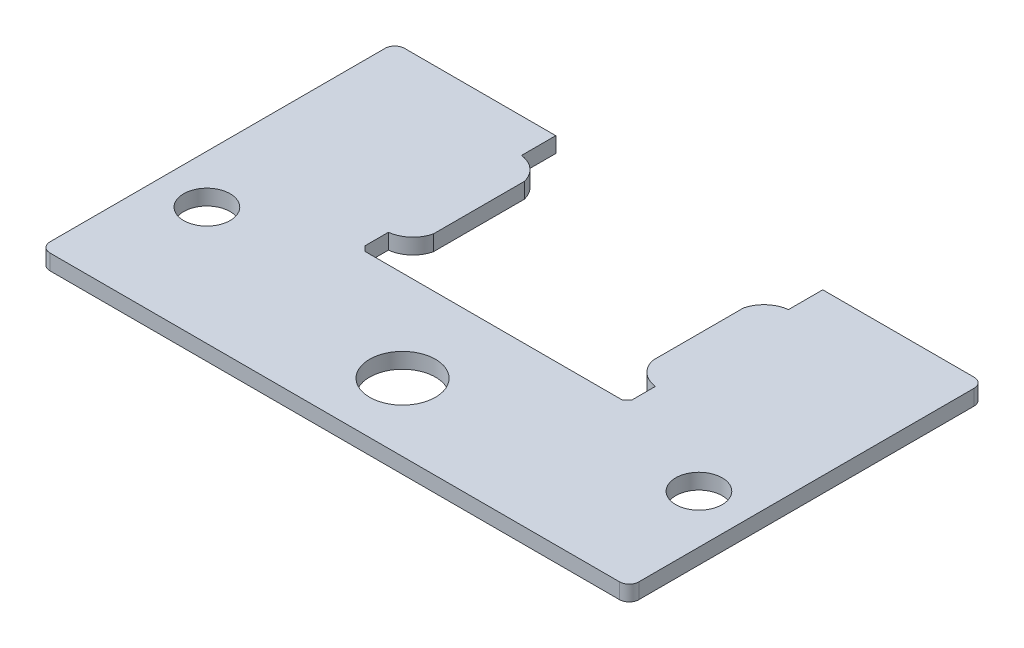
ISO-10303-21;
HEADER;
FILE_DESCRIPTION(('STEP AP214'),'2;1');
FILE_NAME('part.step','',(''),(''),'','','');
FILE_SCHEMA(('AUTOMOTIVE_DESIGN { 1 0 10303 214 1 1 1 1 }'));
ENDSEC;
DATA;
#1=APPLICATION_CONTEXT('core data for automotive mechanical design processes');
#2=APPLICATION_PROTOCOL_DEFINITION('international standard','automotive_design',2000,#1);
#3=PRODUCT_CONTEXT('',#1,'mechanical');
#4=PRODUCT('Part','Part','',(#3));
#5=PRODUCT_RELATED_PRODUCT_CATEGORY('part','',(#4));
#6=PRODUCT_DEFINITION_FORMATION('','',#4);
#7=PRODUCT_DEFINITION_CONTEXT('part definition',#1,'design');
#8=PRODUCT_DEFINITION('design','',#6,#7);
#9=PRODUCT_DEFINITION_SHAPE('','',#8);
#10=(LENGTH_UNIT() NAMED_UNIT(*) SI_UNIT(.MILLI.,.METRE.));
#11=(NAMED_UNIT(*) PLANE_ANGLE_UNIT() SI_UNIT($,.RADIAN.));
#12=(NAMED_UNIT(*) SI_UNIT($,.STERADIAN.) SOLID_ANGLE_UNIT());
#13=UNCERTAINTY_MEASURE_WITH_UNIT(LENGTH_MEASURE(1.E-05),#10,'distance_accuracy_value','');
#14=(GEOMETRIC_REPRESENTATION_CONTEXT(3) GLOBAL_UNCERTAINTY_ASSIGNED_CONTEXT((#13)) GLOBAL_UNIT_ASSIGNED_CONTEXT((#10,
#11,#12)) REPRESENTATION_CONTEXT('',''));
#15=CARTESIAN_POINT('',(0.,0.,0.));
#16=DIRECTION('',(0.,0.,1.));
#17=DIRECTION('',(1.,0.,0.));
#18=AXIS2_PLACEMENT_3D('',#15,#16,#17);
#19=CARTESIAN_POINT('',(0.,64.3,14.05));
#20=DIRECTION('',(0.,-1.,0.));
#21=DIRECTION('',(0.,0.,-1.));
#22=AXIS2_PLACEMENT_3D('',#19,#20,#21);
#23=PLANE('',#22);
#24=CARTESIAN_POINT('',(0.,64.3,19.7));
#25=DIRECTION('',(0.,1.,0.));
#26=DIRECTION('',(0.,0.,1.));
#27=AXIS2_PLACEMENT_3D('',#24,#25,#26);
#28=CIRCLE('',#27,1.7);
#29=CARTESIAN_POINT('',(0.,64.3,21.4));
#30=VERTEX_POINT('',#29);
#31=EDGE_CURVE('E167',#30,#30,#28,.T.);
#32=ORIENTED_EDGE('',*,*,#31,.T.);
#33=EDGE_LOOP('',(#32));
#34=FACE_BOUND('',#33,.T.);
#35=CARTESIAN_POINT('',(-12.7,64.3,17.1));
#36=DIRECTION('',(0.,1.,0.));
#37=DIRECTION('',(0.,0.,1.));
#38=AXIS2_PLACEMENT_3D('',#35,#36,#37);
#39=CIRCLE('',#38,1.2);
#40=CARTESIAN_POINT('',(-12.7,64.3,18.3));
#41=VERTEX_POINT('',#40);
#42=EDGE_CURVE('E271',#41,#41,#39,.T.);
#43=ORIENTED_EDGE('',*,*,#42,.T.);
#44=EDGE_LOOP('',(#43));
#45=FACE_BOUND('',#44,.T.);
#46=CARTESIAN_POINT('',(12.7,64.3,17.1));
#47=DIRECTION('',(0.,1.,0.));
#48=DIRECTION('',(0.,0.,1.));
#49=AXIS2_PLACEMENT_3D('',#46,#47,#48);
#50=CIRCLE('',#49,1.2);
#51=CARTESIAN_POINT('',(12.7,64.3,18.3));
#52=VERTEX_POINT('',#51);
#53=EDGE_CURVE('E268',#52,#52,#50,.T.);
#54=ORIENTED_EDGE('',*,*,#53,.T.);
#55=EDGE_LOOP('',(#54));
#56=FACE_BOUND('',#55,.T.);
#57=DIRECTION('',(0.,0.,-1.));
#58=VECTOR('',#57,1.);
#59=CARTESIAN_POINT('',(5.6577399,64.3,10.10375));
#60=LINE('',#59,#58);
#61=CARTESIAN_POINT('',(5.6577399,64.3,12.45375));
#62=VERTEX_POINT('',#61);
#63=CARTESIAN_POINT('',(5.6577399,64.3,7.75375));
#64=VERTEX_POINT('',#63);
#65=EDGE_CURVE('E172',#62,#64,#60,.T.);
#66=ORIENTED_EDGE('',*,*,#65,.T.);
#67=CARTESIAN_POINT('',(7.0597692985419,64.3,8.10351929911236));
#68=DIRECTION('',(0.,1.,0.));
#69=DIRECTION('',(0.,0.,1.));
#70=AXIS2_PLACEMENT_3D('',#67,#68,#69);
#71=CIRCLE('',#70,1.44499999895409);
#72=CARTESIAN_POINT('',(6.89125,64.3,6.6683795));
#73=VERTEX_POINT('',#72);
#74=EDGE_CURVE('E276',#64,#73,#71,.F.);
#75=ORIENTED_EDGE('',*,*,#74,.T.);
#76=DIRECTION('',(0.,0.,-1.));
#77=VECTOR('',#76,1.);
#78=CARTESIAN_POINT('',(6.89125,64.3,5.48774314));
#79=LINE('',#78,#77);
#80=CARTESIAN_POINT('',(6.89125,64.3,4.9));
#81=VERTEX_POINT('',#80);
#82=EDGE_CURVE('E152',#73,#81,#79,.T.);
#83=ORIENTED_EDGE('',*,*,#82,.T.);
#84=DIRECTION('',(-1.,0.,0.));
#85=VECTOR('',#84,1.);
#86=CARTESIAN_POINT('',(0.,64.3,4.9));
#87=LINE('',#86,#85);
#88=CARTESIAN_POINT('',(14.7,64.3,4.9));
#89=VERTEX_POINT('',#88);
#90=EDGE_CURVE('E149',#89,#81,#87,.T.);
#91=ORIENTED_EDGE('',*,*,#90,.F.);
#92=CARTESIAN_POINT('',(14.7,64.3,5.4));
#93=DIRECTION('',(0.,-1.,0.));
#94=DIRECTION('',(0.,0.,-1.));
#95=AXIS2_PLACEMENT_3D('',#92,#93,#94);
#96=CIRCLE('',#95,0.500000000000002);
#97=CARTESIAN_POINT('',(15.2,64.3,5.4));
#98=VERTEX_POINT('',#97);
#99=EDGE_CURVE('E19',#98,#89,#96,.F.);
#100=ORIENTED_EDGE('',*,*,#99,.F.);
#101=DIRECTION('',(0.,0.,-1.));
#102=VECTOR('',#101,1.);
#103=CARTESIAN_POINT('',(15.2,64.3,14.05));
#104=LINE('',#103,#102);
#105=CARTESIAN_POINT('',(15.2,64.3,22.7));
#106=VERTEX_POINT('',#105);
#107=EDGE_CURVE('E136',#106,#98,#104,.T.);
#108=ORIENTED_EDGE('',*,*,#107,.F.);
#109=CARTESIAN_POINT('',(14.7,64.3,22.7));
#110=DIRECTION('',(0.,-1.,0.));
#111=DIRECTION('',(0.,0.,-1.));
#112=AXIS2_PLACEMENT_3D('',#109,#110,#111);
#113=CIRCLE('',#112,0.500000000000001);
#114=CARTESIAN_POINT('',(14.7,64.3,23.2));
#115=VERTEX_POINT('',#114);
#116=EDGE_CURVE('E288',#115,#106,#113,.F.);
#117=ORIENTED_EDGE('',*,*,#116,.F.);
#118=DIRECTION('',(1.,0.,0.));
#119=VECTOR('',#118,1.);
#120=CARTESIAN_POINT('',(7.35,64.3,23.2));
#121=LINE('',#120,#119);
#122=CARTESIAN_POINT('',(-14.7,64.3,23.2));
#123=VERTEX_POINT('',#122);
#124=EDGE_CURVE('E226',#123,#115,#121,.T.);
#125=ORIENTED_EDGE('',*,*,#124,.F.);
#126=CARTESIAN_POINT('',(-14.7,64.3,22.7));
#127=DIRECTION('',(0.,-1.,0.));
#128=DIRECTION('',(0.,0.,-1.));
#129=AXIS2_PLACEMENT_3D('',#126,#127,#128);
#130=CIRCLE('',#129,0.500000000000002);
#131=CARTESIAN_POINT('',(-15.2,64.3,22.7));
#132=VERTEX_POINT('',#131);
#133=EDGE_CURVE('E287',#132,#123,#130,.F.);
#134=ORIENTED_EDGE('',*,*,#133,.F.);
#135=DIRECTION('',(0.,0.,1.));
#136=VECTOR('',#135,1.);
#137=CARTESIAN_POINT('',(-15.2,64.3,14.05));
#138=LINE('',#137,#136);
#139=CARTESIAN_POINT('',(-15.2,64.3,5.4));
#140=VERTEX_POINT('',#139);
#141=EDGE_CURVE('E222',#140,#132,#138,.T.);
#142=ORIENTED_EDGE('',*,*,#141,.F.);
#143=CARTESIAN_POINT('',(-14.7,64.3,5.4));
#144=DIRECTION('',(0.,-1.,0.));
#145=DIRECTION('',(0.,0.,-1.));
#146=AXIS2_PLACEMENT_3D('',#143,#144,#145);
#147=CIRCLE('',#146,0.500000000000004);
#148=CARTESIAN_POINT('',(-14.7,64.3,4.9));
#149=VERTEX_POINT('',#148);
#150=EDGE_CURVE('E285',#149,#140,#147,.F.);
#151=ORIENTED_EDGE('',*,*,#150,.F.);
#152=DIRECTION('',(-1.,0.,0.));
#153=VECTOR('',#152,1.);
#154=CARTESIAN_POINT('',(0.,64.3,4.9));
#155=LINE('',#154,#153);
#156=CARTESIAN_POINT('',(-6.89125,64.3,4.9));
#157=VERTEX_POINT('',#156);
#158=EDGE_CURVE('E216',#157,#149,#155,.T.);
#159=ORIENTED_EDGE('',*,*,#158,.F.);
#160=DIRECTION('',(0.,0.,1.));
#161=VECTOR('',#160,1.);
#162=CARTESIAN_POINT('',(-6.89125,64.3,5.48774314));
#163=LINE('',#162,#161);
#164=CARTESIAN_POINT('',(-6.89125,64.3,6.6683795));
#165=VERTEX_POINT('',#164);
#166=EDGE_CURVE('E210',#157,#165,#163,.T.);
#167=ORIENTED_EDGE('',*,*,#166,.T.);
#168=CARTESIAN_POINT('',(-7.05976930069488,64.3,8.10351930155919));
#169=DIRECTION('',(0.,1.,0.));
#170=DIRECTION('',(0.,0.,1.));
#171=AXIS2_PLACEMENT_3D('',#168,#169,#170);
#172=CIRCLE('',#171,1.44500000163531);
#173=CARTESIAN_POINT('',(-5.6577399,64.3,7.75375));
#174=VERTEX_POINT('',#173);
#175=EDGE_CURVE('E283',#165,#174,#172,.F.);
#176=ORIENTED_EDGE('',*,*,#175,.T.);
#177=DIRECTION('',(0.,0.,1.));
#178=VECTOR('',#177,1.);
#179=CARTESIAN_POINT('',(-5.6577399,64.3,10.10375));
#180=LINE('',#179,#178);
#181=CARTESIAN_POINT('',(-5.6577399,64.3,12.45375));
#182=VERTEX_POINT('',#181);
#183=EDGE_CURVE('E206',#174,#182,#180,.T.);
#184=ORIENTED_EDGE('',*,*,#183,.T.);
#185=CARTESIAN_POINT('',(-7.05976929854191,64.3,12.1039807008876));
#186=DIRECTION('',(0.,1.,0.));
#187=DIRECTION('',(0.,0.,1.));
#188=AXIS2_PLACEMENT_3D('',#185,#186,#187);
#189=CIRCLE('',#188,1.44499999895409);
#190=CARTESIAN_POINT('',(-6.89125,64.3,13.5391205));
#191=VERTEX_POINT('',#190);
#192=EDGE_CURVE('E281',#182,#191,#189,.F.);
#193=ORIENTED_EDGE('',*,*,#192,.T.);
#194=DIRECTION('',(0.,0.,1.));
#195=VECTOR('',#194,1.);
#196=CARTESIAN_POINT('',(-6.89125,64.3,14.14893525));
#197=LINE('',#196,#195);
#198=CARTESIAN_POINT('',(-6.89125,64.3,14.75875));
#199=VERTEX_POINT('',#198);
#200=EDGE_CURVE('E200',#191,#199,#197,.T.);
#201=ORIENTED_EDGE('',*,*,#200,.T.);
#202=DIRECTION('',(0.707106781186546,0.,0.707106781186549));
#203=VECTOR('',#202,1.);
#204=CARTESIAN_POINT('',(-6.770625,64.3,14.879375));
#205=LINE('',#204,#203);
#206=CARTESIAN_POINT('',(-6.65,64.3,15.));
#207=VERTEX_POINT('',#206);
#208=EDGE_CURVE('E194',#199,#207,#205,.T.);
#209=ORIENTED_EDGE('',*,*,#208,.T.);
#210=DIRECTION('',(1.,0.,0.));
#211=VECTOR('',#210,1.);
#212=CARTESIAN_POINT('',(0.,64.3,15.));
#213=LINE('',#212,#211);
#214=CARTESIAN_POINT('',(6.65,64.3,15.));
#215=VERTEX_POINT('',#214);
#216=EDGE_CURVE('E188',#207,#215,#213,.T.);
#217=ORIENTED_EDGE('',*,*,#216,.T.);
#218=DIRECTION('',(0.707106781186546,0.,-0.707106781186549));
#219=VECTOR('',#218,1.);
#220=CARTESIAN_POINT('',(6.770625,64.3,14.879375));
#221=LINE('',#220,#219);
#222=CARTESIAN_POINT('',(6.89125,64.3,14.75875));
#223=VERTEX_POINT('',#222);
#224=EDGE_CURVE('E182',#215,#223,#221,.T.);
#225=ORIENTED_EDGE('',*,*,#224,.T.);
#226=DIRECTION('',(0.,0.,-1.));
#227=VECTOR('',#226,1.);
#228=CARTESIAN_POINT('',(6.89125,64.3,14.14893525));
#229=LINE('',#228,#227);
#230=CARTESIAN_POINT('',(6.89125,64.3,13.5391205));
#231=VERTEX_POINT('',#230);
#232=EDGE_CURVE('E176',#223,#231,#229,.T.);
#233=ORIENTED_EDGE('',*,*,#232,.T.);
#234=CARTESIAN_POINT('',(7.05976930069488,64.3,12.1039806984408));
#235=DIRECTION('',(0.,1.,0.));
#236=DIRECTION('',(0.,0.,1.));
#237=AXIS2_PLACEMENT_3D('',#234,#235,#236);
#238=CIRCLE('',#237,1.44500000163531);
#239=EDGE_CURVE('E279',#231,#62,#238,.F.);
#240=ORIENTED_EDGE('',*,*,#239,.T.);
#241=EDGE_LOOP('',(#66,#75,#83,#91,#100,#108,#117,#125,#134,#142,#151,#159,#167,#176,#184,#193,
#201,#209,#217,#225,#233,#240));
#242=FACE_BOUND('',#241,.T.);
#243=ADVANCED_FACE('F16',(#34,#45,#56,#242),#23,.T.);
#244=CARTESIAN_POINT('',(0.,65.1,4.9));
#245=DIRECTION('',(0.,0.,-1.));
#246=DIRECTION('',(-1.,0.,0.));
#247=AXIS2_PLACEMENT_3D('',#244,#245,#246);
#248=PLANE('',#247);
#249=DIRECTION('',(0.,-1.,0.));
#250=VECTOR('',#249,1.);
#251=CARTESIAN_POINT('',(14.7,65.1,4.9));
#252=LINE('',#251,#250);
#253=CARTESIAN_POINT('',(14.7,65.1,4.9));
#254=VERTEX_POINT('',#253);
#255=EDGE_CURVE('E145',#89,#254,#252,.F.);
#256=ORIENTED_EDGE('',*,*,#255,.F.);
#257=ORIENTED_EDGE('',*,*,#90,.T.);
#258=DIRECTION('',(0.,1.,0.));
#259=VECTOR('',#258,1.);
#260=CARTESIAN_POINT('',(6.89125,60.3,4.9));
#261=LINE('',#260,#259);
#262=CARTESIAN_POINT('',(6.89125,65.1,4.9));
#263=VERTEX_POINT('',#262);
#264=EDGE_CURVE('E278',#81,#263,#261,.T.);
#265=ORIENTED_EDGE('',*,*,#264,.T.);
#266=DIRECTION('',(1.,0.,0.));
#267=VECTOR('',#266,1.);
#268=CARTESIAN_POINT('',(0.,65.1,4.9));
#269=LINE('',#268,#267);
#270=EDGE_CURVE('E160',#263,#254,#269,.T.);
#271=ORIENTED_EDGE('',*,*,#270,.T.);
#272=EDGE_LOOP('',(#256,#257,#265,#271));
#273=FACE_BOUND('',#272,.T.);
#274=ADVANCED_FACE('F158',(#273),#248,.T.);
#275=CARTESIAN_POINT('',(14.7,65.1,5.4));
#276=DIRECTION('',(0.,-1.,0.));
#277=DIRECTION('',(0.,0.,-1.));
#278=AXIS2_PLACEMENT_3D('',#275,#276,#277);
#279=CYLINDRICAL_SURFACE('',#278,0.500000000000002);
#280=CARTESIAN_POINT('',(14.7,65.1,5.4));
#281=DIRECTION('',(0.,-1.,0.));
#282=DIRECTION('',(0.,0.,-1.));
#283=AXIS2_PLACEMENT_3D('',#280,#281,#282);
#284=CIRCLE('',#283,0.500000000000002);
#285=CARTESIAN_POINT('',(15.2,65.1,5.4));
#286=VERTEX_POINT('',#285);
#287=EDGE_CURVE('E266',#254,#286,#284,.T.);
#288=ORIENTED_EDGE('',*,*,#287,.T.);
#289=DIRECTION('',(0.,1.,0.));
#290=VECTOR('',#289,1.);
#291=CARTESIAN_POINT('',(15.2,65.1,5.4));
#292=LINE('',#291,#290);
#293=EDGE_CURVE('E147',#98,#286,#292,.T.);
#294=ORIENTED_EDGE('',*,*,#293,.F.);
#295=ORIENTED_EDGE('',*,*,#99,.T.);
#296=ORIENTED_EDGE('',*,*,#255,.T.);
#297=EDGE_LOOP('',(#288,#294,#295,#296));
#298=FACE_BOUND('',#297,.T.);
#299=ADVANCED_FACE('F143',(#298),#279,.T.);
#300=CARTESIAN_POINT('',(15.2,65.1,14.05));
#301=DIRECTION('',(1.,0.,0.));
#302=DIRECTION('',(0.,0.,-1.));
#303=AXIS2_PLACEMENT_3D('',#300,#301,#302);
#304=PLANE('',#303);
#305=DIRECTION('',(0.,0.,-1.));
#306=VECTOR('',#305,1.);
#307=CARTESIAN_POINT('',(15.2,65.1,14.05));
#308=LINE('',#307,#306);
#309=CARTESIAN_POINT('',(15.2,65.1,22.7));
#310=VERTEX_POINT('',#309);
#311=EDGE_CURVE('E265',#286,#310,#308,.F.);
#312=ORIENTED_EDGE('',*,*,#311,.T.);
#313=DIRECTION('',(0.,-1.,0.));
#314=VECTOR('',#313,1.);
#315=CARTESIAN_POINT('',(15.2,65.1,22.7));
#316=LINE('',#315,#314);
#317=EDGE_CURVE('E228',#106,#310,#316,.F.);
#318=ORIENTED_EDGE('',*,*,#317,.F.);
#319=ORIENTED_EDGE('',*,*,#107,.T.);
#320=ORIENTED_EDGE('',*,*,#293,.T.);
#321=EDGE_LOOP('',(#312,#318,#319,#320));
#322=FACE_BOUND('',#321,.T.);
#323=ADVANCED_FACE('F294',(#322),#304,.T.);
#324=CARTESIAN_POINT('',(14.7,65.1,22.7));
#325=DIRECTION('',(0.,-1.,0.));
#326=DIRECTION('',(0.,0.,-1.));
#327=AXIS2_PLACEMENT_3D('',#324,#325,#326);
#328=CYLINDRICAL_SURFACE('',#327,0.500000000000001);
#329=CARTESIAN_POINT('',(14.7,65.1,22.7));
#330=DIRECTION('',(0.,-1.,0.));
#331=DIRECTION('',(0.,0.,-1.));
#332=AXIS2_PLACEMENT_3D('',#329,#330,#331);
#333=CIRCLE('',#332,0.500000000000001);
#334=CARTESIAN_POINT('',(14.7,65.1,23.2));
#335=VERTEX_POINT('',#334);
#336=EDGE_CURVE('E262',#310,#335,#333,.T.);
#337=ORIENTED_EDGE('',*,*,#336,.T.);
#338=DIRECTION('',(0.,-1.,0.));
#339=VECTOR('',#338,1.);
#340=CARTESIAN_POINT('',(14.7,65.1,23.2));
#341=LINE('',#340,#339);
#342=EDGE_CURVE('E227',#115,#335,#341,.F.);
#343=ORIENTED_EDGE('',*,*,#342,.F.);
#344=ORIENTED_EDGE('',*,*,#116,.T.);
#345=ORIENTED_EDGE('',*,*,#317,.T.);
#346=EDGE_LOOP('',(#337,#343,#344,#345));
#347=FACE_BOUND('',#346,.T.);
#348=ADVANCED_FACE('F371',(#347),#328,.T.);
#349=CARTESIAN_POINT('',(7.35,65.1,23.2));
#350=DIRECTION('',(0.,0.,1.));
#351=DIRECTION('',(0.,-1.,0.));
#352=AXIS2_PLACEMENT_3D('',#349,#350,#351);
#353=PLANE('',#352);
#354=DIRECTION('',(1.,0.,0.));
#355=VECTOR('',#354,1.);
#356=CARTESIAN_POINT('',(0.,65.1,23.2));
#357=LINE('',#356,#355);
#358=CARTESIAN_POINT('',(-14.7,65.1,23.2));
#359=VERTEX_POINT('',#358);
#360=EDGE_CURVE('E261',#335,#359,#357,.F.);
#361=ORIENTED_EDGE('',*,*,#360,.T.);
#362=DIRECTION('',(0.,-1.,0.));
#363=VECTOR('',#362,1.);
#364=CARTESIAN_POINT('',(-14.7,65.1,23.2));
#365=LINE('',#364,#363);
#366=EDGE_CURVE('E225',#123,#359,#365,.F.);
#367=ORIENTED_EDGE('',*,*,#366,.F.);
#368=ORIENTED_EDGE('',*,*,#124,.T.);
#369=ORIENTED_EDGE('',*,*,#342,.T.);
#370=EDGE_LOOP('',(#361,#367,#368,#369));
#371=FACE_BOUND('',#370,.T.);
#372=ADVANCED_FACE('F366',(#371),#353,.T.);
#373=CARTESIAN_POINT('',(-14.7,65.1,22.7));
#374=DIRECTION('',(0.,-1.,0.));
#375=DIRECTION('',(0.,0.,-1.));
#376=AXIS2_PLACEMENT_3D('',#373,#374,#375);
#377=CYLINDRICAL_SURFACE('',#376,0.500000000000002);
#378=CARTESIAN_POINT('',(-14.7,65.1,22.7));
#379=DIRECTION('',(0.,-1.,0.));
#380=DIRECTION('',(0.,0.,-1.));
#381=AXIS2_PLACEMENT_3D('',#378,#379,#380);
#382=CIRCLE('',#381,0.500000000000002);
#383=CARTESIAN_POINT('',(-15.2,65.1,22.7));
#384=VERTEX_POINT('',#383);
#385=EDGE_CURVE('E258',#359,#384,#382,.T.);
#386=ORIENTED_EDGE('',*,*,#385,.T.);
#387=DIRECTION('',(0.,1.,0.));
#388=VECTOR('',#387,1.);
#389=CARTESIAN_POINT('',(-15.2,65.1,22.7));
#390=LINE('',#389,#388);
#391=EDGE_CURVE('E224',#132,#384,#390,.T.);
#392=ORIENTED_EDGE('',*,*,#391,.F.);
#393=ORIENTED_EDGE('',*,*,#133,.T.);
#394=ORIENTED_EDGE('',*,*,#366,.T.);
#395=EDGE_LOOP('',(#386,#392,#393,#394));
#396=FACE_BOUND('',#395,.T.);
#397=ADVANCED_FACE('F379',(#396),#377,.T.);
#398=CARTESIAN_POINT('',(-15.2,65.1,14.05));
#399=DIRECTION('',(-1.,0.,0.));
#400=DIRECTION('',(0.,0.,1.));
#401=AXIS2_PLACEMENT_3D('',#398,#399,#400);
#402=PLANE('',#401);
#403=DIRECTION('',(0.,0.,-1.));
#404=VECTOR('',#403,1.);
#405=CARTESIAN_POINT('',(-15.2,65.1,14.05));
#406=LINE('',#405,#404);
#407=CARTESIAN_POINT('',(-15.2,65.1,5.4));
#408=VERTEX_POINT('',#407);
#409=EDGE_CURVE('E257',#384,#408,#406,.T.);
#410=ORIENTED_EDGE('',*,*,#409,.T.);
#411=DIRECTION('',(0.,-1.,0.));
#412=VECTOR('',#411,1.);
#413=CARTESIAN_POINT('',(-15.2,65.1,5.4));
#414=LINE('',#413,#412);
#415=EDGE_CURVE('E219',#140,#408,#414,.F.);
#416=ORIENTED_EDGE('',*,*,#415,.F.);
#417=ORIENTED_EDGE('',*,*,#141,.T.);
#418=ORIENTED_EDGE('',*,*,#391,.T.);
#419=EDGE_LOOP('',(#410,#416,#417,#418));
#420=FACE_BOUND('',#419,.T.);
#421=ADVANCED_FACE('F461',(#420),#402,.T.);
#422=CARTESIAN_POINT('',(-14.7,65.1,5.4));
#423=DIRECTION('',(0.,-1.,0.));
#424=DIRECTION('',(0.,0.,-1.));
#425=AXIS2_PLACEMENT_3D('',#422,#423,#424);
#426=CYLINDRICAL_SURFACE('',#425,0.500000000000004);
#427=CARTESIAN_POINT('',(-14.7,65.1,5.4));
#428=DIRECTION('',(0.,-1.,0.));
#429=DIRECTION('',(0.,0.,-1.));
#430=AXIS2_PLACEMENT_3D('',#427,#428,#429);
#431=CIRCLE('',#430,0.500000000000004);
#432=CARTESIAN_POINT('',(-14.7,65.1,4.9));
#433=VERTEX_POINT('',#432);
#434=EDGE_CURVE('E253',#408,#433,#431,.T.);
#435=ORIENTED_EDGE('',*,*,#434,.T.);
#436=DIRECTION('',(0.,1.,0.));
#437=VECTOR('',#436,1.);
#438=CARTESIAN_POINT('',(-14.7,65.1,4.9));
#439=LINE('',#438,#437);
#440=EDGE_CURVE('E218',#149,#433,#439,.T.);
#441=ORIENTED_EDGE('',*,*,#440,.F.);
#442=ORIENTED_EDGE('',*,*,#150,.T.);
#443=ORIENTED_EDGE('',*,*,#415,.T.);
#444=EDGE_LOOP('',(#435,#441,#442,#443));
#445=FACE_BOUND('',#444,.T.);
#446=ADVANCED_FACE('F457',(#445),#426,.T.);
#447=CARTESIAN_POINT('',(0.,65.1,4.9));
#448=DIRECTION('',(0.,0.,-1.));
#449=DIRECTION('',(-1.,0.,0.));
#450=AXIS2_PLACEMENT_3D('',#447,#448,#449);
#451=PLANE('',#450);
#452=ORIENTED_EDGE('',*,*,#440,.T.);
#453=DIRECTION('',(1.,0.,0.));
#454=VECTOR('',#453,1.);
#455=CARTESIAN_POINT('',(0.,65.1,4.9));
#456=LINE('',#455,#454);
#457=CARTESIAN_POINT('',(-6.89125,65.1,4.9));
#458=VERTEX_POINT('',#457);
#459=EDGE_CURVE('E256',#433,#458,#456,.T.);
#460=ORIENTED_EDGE('',*,*,#459,.T.);
#461=DIRECTION('',(0.,1.,0.));
#462=VECTOR('',#461,1.);
#463=CARTESIAN_POINT('',(-6.89125,60.3,4.9));
#464=LINE('',#463,#462);
#465=EDGE_CURVE('E213',#458,#157,#464,.F.);
#466=ORIENTED_EDGE('',*,*,#465,.T.);
#467=ORIENTED_EDGE('',*,*,#158,.T.);
#468=EDGE_LOOP('',(#452,#460,#466,#467));
#469=FACE_BOUND('',#468,.T.);
#470=ADVANCED_FACE('F453',(#469),#451,.T.);
#471=CARTESIAN_POINT('',(-6.89125,60.3,5.48774314));
#472=DIRECTION('',(-1.,0.,0.));
#473=DIRECTION('',(0.,0.,1.));
#474=AXIS2_PLACEMENT_3D('',#471,#472,#473);
#475=PLANE('',#474);
#476=ORIENTED_EDGE('',*,*,#465,.F.);
#477=DIRECTION('',(0.,0.,-1.));
#478=VECTOR('',#477,1.);
#479=CARTESIAN_POINT('',(-6.89125,65.1,14.05));
#480=LINE('',#479,#478);
#481=CARTESIAN_POINT('',(-6.89125,65.1,6.6683795));
#482=VERTEX_POINT('',#481);
#483=EDGE_CURVE('E252',#458,#482,#480,.F.);
#484=ORIENTED_EDGE('',*,*,#483,.T.);
#485=DIRECTION('',(0.,1.,0.));
#486=VECTOR('',#485,1.);
#487=CARTESIAN_POINT('',(-6.89125,60.3,6.6683795));
#488=LINE('',#487,#486);
#489=EDGE_CURVE('E212',#482,#165,#488,.F.);
#490=ORIENTED_EDGE('',*,*,#489,.T.);
#491=ORIENTED_EDGE('',*,*,#166,.F.);
#492=EDGE_LOOP('',(#476,#484,#490,#491));
#493=FACE_BOUND('',#492,.T.);
#494=ADVANCED_FACE('F449',(#493),#475,.F.);
#495=CARTESIAN_POINT('',(-7.05976930069488,64.3,8.10351930155919));
#496=DIRECTION('',(0.,1.,0.));
#497=DIRECTION('',(0.,0.,1.));
#498=AXIS2_PLACEMENT_3D('',#495,#496,#497);
#499=CYLINDRICAL_SURFACE('',#498,1.44500000163531);
#500=ORIENTED_EDGE('',*,*,#489,.F.);
#501=CARTESIAN_POINT('',(-7.05976930069488,65.1,8.10351930155919));
#502=DIRECTION('',(0.,1.,0.));
#503=DIRECTION('',(0.,0.,1.));
#504=AXIS2_PLACEMENT_3D('',#501,#502,#503);
#505=CIRCLE('',#504,1.44500000163531);
#506=CARTESIAN_POINT('',(-5.6577399,65.1,7.75375));
#507=VERTEX_POINT('',#506);
#508=EDGE_CURVE('E249',#482,#507,#505,.F.);
#509=ORIENTED_EDGE('',*,*,#508,.T.);
#510=DIRECTION('',(0.,1.,0.));
#511=VECTOR('',#510,1.);
#512=CARTESIAN_POINT('',(-5.6577399,60.3,7.75375));
#513=LINE('',#512,#511);
#514=EDGE_CURVE('E209',#507,#174,#513,.F.);
#515=ORIENTED_EDGE('',*,*,#514,.T.);
#516=ORIENTED_EDGE('',*,*,#175,.F.);
#517=EDGE_LOOP('',(#500,#509,#515,#516));
#518=FACE_BOUND('',#517,.T.);
#519=ADVANCED_FACE('F445',(#518),#499,.T.);
#520=CARTESIAN_POINT('',(-5.6577399,60.3,10.10375));
#521=DIRECTION('',(-1.,0.,0.));
#522=DIRECTION('',(0.,0.,1.));
#523=AXIS2_PLACEMENT_3D('',#520,#521,#522);
#524=PLANE('',#523);
#525=ORIENTED_EDGE('',*,*,#514,.F.);
#526=DIRECTION('',(0.,0.,-1.));
#527=VECTOR('',#526,1.);
#528=CARTESIAN_POINT('',(-5.6577399,65.1,14.05));
#529=LINE('',#528,#527);
#530=CARTESIAN_POINT('',(-5.6577399,65.1,12.45375));
#531=VERTEX_POINT('',#530);
#532=EDGE_CURVE('E248',#507,#531,#529,.F.);
#533=ORIENTED_EDGE('',*,*,#532,.T.);
#534=DIRECTION('',(0.,1.,0.));
#535=VECTOR('',#534,1.);
#536=CARTESIAN_POINT('',(-5.6577399,60.3,12.45375));
#537=LINE('',#536,#535);
#538=EDGE_CURVE('E208',#531,#182,#537,.F.);
#539=ORIENTED_EDGE('',*,*,#538,.T.);
#540=ORIENTED_EDGE('',*,*,#183,.F.);
#541=EDGE_LOOP('',(#525,#533,#539,#540));
#542=FACE_BOUND('',#541,.T.);
#543=ADVANCED_FACE('F441',(#542),#524,.F.);
#544=CARTESIAN_POINT('',(-7.05976929854191,64.3,12.1039807008876));
#545=DIRECTION('',(0.,1.,0.));
#546=DIRECTION('',(0.,0.,1.));
#547=AXIS2_PLACEMENT_3D('',#544,#545,#546);
#548=CYLINDRICAL_SURFACE('',#547,1.44499999895409);
#549=ORIENTED_EDGE('',*,*,#538,.F.);
#550=CARTESIAN_POINT('',(-7.05976929854191,65.1,12.1039807008876));
#551=DIRECTION('',(0.,1.,0.));
#552=DIRECTION('',(0.,0.,1.));
#553=AXIS2_PLACEMENT_3D('',#550,#551,#552);
#554=CIRCLE('',#553,1.44499999895409);
#555=CARTESIAN_POINT('',(-6.89125,65.1,13.5391205));
#556=VERTEX_POINT('',#555);
#557=EDGE_CURVE('E244',#531,#556,#554,.F.);
#558=ORIENTED_EDGE('',*,*,#557,.T.);
#559=DIRECTION('',(0.,1.,0.));
#560=VECTOR('',#559,1.);
#561=CARTESIAN_POINT('',(-6.89125,60.3,13.5391205));
#562=LINE('',#561,#560);
#563=EDGE_CURVE('E203',#556,#191,#562,.F.);
#564=ORIENTED_EDGE('',*,*,#563,.T.);
#565=ORIENTED_EDGE('',*,*,#192,.F.);
#566=EDGE_LOOP('',(#549,#558,#564,#565));
#567=FACE_BOUND('',#566,.T.);
#568=ADVANCED_FACE('F437',(#567),#548,.T.);
#569=CARTESIAN_POINT('',(-6.89125,60.3,14.14893525));
#570=DIRECTION('',(-1.,0.,0.));
#571=DIRECTION('',(0.,0.,1.));
#572=AXIS2_PLACEMENT_3D('',#569,#570,#571);
#573=PLANE('',#572);
#574=ORIENTED_EDGE('',*,*,#563,.F.);
#575=DIRECTION('',(0.,0.,-1.));
#576=VECTOR('',#575,1.);
#577=CARTESIAN_POINT('',(-6.89125,65.1,14.05));
#578=LINE('',#577,#576);
#579=CARTESIAN_POINT('',(-6.89125,65.1,14.75875));
#580=VERTEX_POINT('',#579);
#581=EDGE_CURVE('E247',#556,#580,#578,.F.);
#582=ORIENTED_EDGE('',*,*,#581,.T.);
#583=DIRECTION('',(0.,1.,0.));
#584=VECTOR('',#583,1.);
#585=CARTESIAN_POINT('',(-6.89125,60.3,14.75875));
#586=LINE('',#585,#584);
#587=EDGE_CURVE('E197',#580,#199,#586,.F.);
#588=ORIENTED_EDGE('',*,*,#587,.T.);
#589=ORIENTED_EDGE('',*,*,#200,.F.);
#590=EDGE_LOOP('',(#574,#582,#588,#589));
#591=FACE_BOUND('',#590,.T.);
#592=ADVANCED_FACE('F433',(#591),#573,.F.);
#593=CARTESIAN_POINT('',(-6.770625,60.3,14.879375));
#594=DIRECTION('',(-0.707106781186549,0.,0.707106781186546));
#595=DIRECTION('',(0.707106781186546,0.,0.707106781186549));
#596=AXIS2_PLACEMENT_3D('',#593,#594,#595);
#597=PLANE('',#596);
#598=ORIENTED_EDGE('',*,*,#587,.F.);
#599=DIRECTION('',(0.707106781186548,0.,0.707106781186548));
#600=VECTOR('',#599,1.);
#601=CARTESIAN_POINT('',(-6.89125,65.1,14.75875));
#602=LINE('',#601,#600);
#603=CARTESIAN_POINT('',(-6.65,65.1,15.));
#604=VERTEX_POINT('',#603);
#605=EDGE_CURVE('E333',#580,#604,#602,.T.);
#606=ORIENTED_EDGE('',*,*,#605,.T.);
#607=DIRECTION('',(0.,-1.,0.));
#608=VECTOR('',#607,1.);
#609=CARTESIAN_POINT('',(-6.65,60.3,15.));
#610=LINE('',#609,#608);
#611=EDGE_CURVE('E191',#604,#207,#610,.T.);
#612=ORIENTED_EDGE('',*,*,#611,.T.);
#613=ORIENTED_EDGE('',*,*,#208,.F.);
#614=EDGE_LOOP('',(#598,#606,#612,#613));
#615=FACE_BOUND('',#614,.T.);
#616=ADVANCED_FACE('F429',(#615),#597,.F.);
#617=CARTESIAN_POINT('',(0.,60.3,15.));
#618=DIRECTION('',(0.,0.,1.));
#619=DIRECTION('',(0.,-1.,0.));
#620=AXIS2_PLACEMENT_3D('',#617,#618,#619);
#621=PLANE('',#620);
#622=ORIENTED_EDGE('',*,*,#611,.F.);
#623=DIRECTION('',(1.,0.,0.));
#624=VECTOR('',#623,1.);
#625=CARTESIAN_POINT('',(0.,65.1,15.));
#626=LINE('',#625,#624);
#627=CARTESIAN_POINT('',(6.65,65.1,15.));
#628=VERTEX_POINT('',#627);
#629=EDGE_CURVE('E324',#604,#628,#626,.T.);
#630=ORIENTED_EDGE('',*,*,#629,.T.);
#631=DIRECTION('',(0.,1.,0.));
#632=VECTOR('',#631,1.);
#633=CARTESIAN_POINT('',(6.65,60.3,15.));
#634=LINE('',#633,#632);
#635=EDGE_CURVE('E185',#628,#215,#634,.F.);
#636=ORIENTED_EDGE('',*,*,#635,.T.);
#637=ORIENTED_EDGE('',*,*,#216,.F.);
#638=EDGE_LOOP('',(#622,#630,#636,#637));
#639=FACE_BOUND('',#638,.T.);
#640=ADVANCED_FACE('F425',(#639),#621,.F.);
#641=CARTESIAN_POINT('',(6.770625,60.3,14.879375));
#642=DIRECTION('',(0.707106781186549,0.,0.707106781186546));
#643=DIRECTION('',(0.707106781186546,0.,-0.707106781186549));
#644=AXIS2_PLACEMENT_3D('',#641,#642,#643);
#645=PLANE('',#644);
#646=ORIENTED_EDGE('',*,*,#635,.F.);
#647=DIRECTION('',(0.707106781186548,0.,-0.707106781186548));
#648=VECTOR('',#647,1.);
#649=CARTESIAN_POINT('',(6.65,65.1,15.));
#650=LINE('',#649,#648);
#651=CARTESIAN_POINT('',(6.89125,65.1,14.75875));
#652=VERTEX_POINT('',#651);
#653=EDGE_CURVE('E321',#628,#652,#650,.T.);
#654=ORIENTED_EDGE('',*,*,#653,.T.);
#655=DIRECTION('',(0.,1.,0.));
#656=VECTOR('',#655,1.);
#657=CARTESIAN_POINT('',(6.89125,60.3,14.75875));
#658=LINE('',#657,#656);
#659=EDGE_CURVE('E179',#652,#223,#658,.F.);
#660=ORIENTED_EDGE('',*,*,#659,.T.);
#661=ORIENTED_EDGE('',*,*,#224,.F.);
#662=EDGE_LOOP('',(#646,#654,#660,#661));
#663=FACE_BOUND('',#662,.T.);
#664=ADVANCED_FACE('F421',(#663),#645,.F.);
#665=CARTESIAN_POINT('',(6.89125,60.3,14.14893525));
#666=DIRECTION('',(1.,0.,0.));
#667=DIRECTION('',(0.,0.,-1.));
#668=AXIS2_PLACEMENT_3D('',#665,#666,#667);
#669=PLANE('',#668);
#670=ORIENTED_EDGE('',*,*,#659,.F.);
#671=DIRECTION('',(0.,0.,-1.));
#672=VECTOR('',#671,1.);
#673=CARTESIAN_POINT('',(6.89125,65.1,14.05));
#674=LINE('',#673,#672);
#675=CARTESIAN_POINT('',(6.89125,65.1,13.5391205));
#676=VERTEX_POINT('',#675);
#677=EDGE_CURVE('E243',#652,#676,#674,.T.);
#678=ORIENTED_EDGE('',*,*,#677,.T.);
#679=DIRECTION('',(0.,1.,0.));
#680=VECTOR('',#679,1.);
#681=CARTESIAN_POINT('',(6.89125,60.3,13.5391205));
#682=LINE('',#681,#680);
#683=EDGE_CURVE('E178',#676,#231,#682,.F.);
#684=ORIENTED_EDGE('',*,*,#683,.T.);
#685=ORIENTED_EDGE('',*,*,#232,.F.);
#686=EDGE_LOOP('',(#670,#678,#684,#685));
#687=FACE_BOUND('',#686,.T.);
#688=ADVANCED_FACE('F417',(#687),#669,.F.);
#689=CARTESIAN_POINT('',(7.05976930069488,64.3,12.1039806984408));
#690=DIRECTION('',(0.,1.,0.));
#691=DIRECTION('',(0.,0.,1.));
#692=AXIS2_PLACEMENT_3D('',#689,#690,#691);
#693=CYLINDRICAL_SURFACE('',#692,1.44500000163531);
#694=ORIENTED_EDGE('',*,*,#683,.F.);
#695=CARTESIAN_POINT('',(7.05976930069488,65.1,12.1039806984408));
#696=DIRECTION('',(0.,1.,0.));
#697=DIRECTION('',(0.,0.,1.));
#698=AXIS2_PLACEMENT_3D('',#695,#696,#697);
#699=CIRCLE('',#698,1.44500000163531);
#700=CARTESIAN_POINT('',(5.6577399,65.1,12.45375));
#701=VERTEX_POINT('',#700);
#702=EDGE_CURVE('E240',#676,#701,#699,.F.);
#703=ORIENTED_EDGE('',*,*,#702,.T.);
#704=DIRECTION('',(0.,1.,0.));
#705=VECTOR('',#704,1.);
#706=CARTESIAN_POINT('',(5.6577399,60.3,12.45375));
#707=LINE('',#706,#705);
#708=EDGE_CURVE('E175',#701,#62,#707,.F.);
#709=ORIENTED_EDGE('',*,*,#708,.T.);
#710=ORIENTED_EDGE('',*,*,#239,.F.);
#711=EDGE_LOOP('',(#694,#703,#709,#710));
#712=FACE_BOUND('',#711,.T.);
#713=ADVANCED_FACE('F413',(#712),#693,.T.);
#714=CARTESIAN_POINT('',(5.6577399,60.3,10.10375));
#715=DIRECTION('',(1.,0.,0.));
#716=DIRECTION('',(0.,0.,-1.));
#717=AXIS2_PLACEMENT_3D('',#714,#715,#716);
#718=PLANE('',#717);
#719=ORIENTED_EDGE('',*,*,#708,.F.);
#720=DIRECTION('',(0.,0.,-1.));
#721=VECTOR('',#720,1.);
#722=CARTESIAN_POINT('',(5.6577399,65.1,14.05));
#723=LINE('',#722,#721);
#724=CARTESIAN_POINT('',(5.6577399,65.1,7.75375));
#725=VERTEX_POINT('',#724);
#726=EDGE_CURVE('E239',#701,#725,#723,.T.);
#727=ORIENTED_EDGE('',*,*,#726,.T.);
#728=DIRECTION('',(0.,1.,0.));
#729=VECTOR('',#728,1.);
#730=CARTESIAN_POINT('',(5.6577399,60.3,7.75375));
#731=LINE('',#730,#729);
#732=EDGE_CURVE('E174',#725,#64,#731,.F.);
#733=ORIENTED_EDGE('',*,*,#732,.T.);
#734=ORIENTED_EDGE('',*,*,#65,.F.);
#735=EDGE_LOOP('',(#719,#727,#733,#734));
#736=FACE_BOUND('',#735,.T.);
#737=ADVANCED_FACE('F409',(#736),#718,.F.);
#738=CARTESIAN_POINT('',(7.0597692985419,64.3,8.10351929911236));
#739=DIRECTION('',(0.,1.,0.));
#740=DIRECTION('',(0.,0.,1.));
#741=AXIS2_PLACEMENT_3D('',#738,#739,#740);
#742=CYLINDRICAL_SURFACE('',#741,1.44499999895409);
#743=ORIENTED_EDGE('',*,*,#732,.F.);
#744=CARTESIAN_POINT('',(7.0597692985419,65.1,8.10351929911236));
#745=DIRECTION('',(0.,1.,0.));
#746=DIRECTION('',(0.,0.,1.));
#747=AXIS2_PLACEMENT_3D('',#744,#745,#746);
#748=CIRCLE('',#747,1.44499999895409);
#749=CARTESIAN_POINT('',(6.89125,65.1,6.6683795));
#750=VERTEX_POINT('',#749);
#751=EDGE_CURVE('E236',#725,#750,#748,.F.);
#752=ORIENTED_EDGE('',*,*,#751,.T.);
#753=DIRECTION('',(0.,1.,0.));
#754=VECTOR('',#753,1.);
#755=CARTESIAN_POINT('',(6.89125,60.3,6.6683795));
#756=LINE('',#755,#754);
#757=EDGE_CURVE('E34',#750,#73,#756,.F.);
#758=ORIENTED_EDGE('',*,*,#757,.T.);
#759=ORIENTED_EDGE('',*,*,#74,.F.);
#760=EDGE_LOOP('',(#743,#752,#758,#759));
#761=FACE_BOUND('',#760,.T.);
#762=ADVANCED_FACE('F406',(#761),#742,.T.);
#763=CARTESIAN_POINT('',(6.89125,60.3,5.48774314));
#764=DIRECTION('',(1.,0.,0.));
#765=DIRECTION('',(0.,0.,-1.));
#766=AXIS2_PLACEMENT_3D('',#763,#764,#765);
#767=PLANE('',#766);
#768=ORIENTED_EDGE('',*,*,#757,.F.);
#769=DIRECTION('',(0.,0.,-1.));
#770=VECTOR('',#769,1.);
#771=CARTESIAN_POINT('',(6.89125,65.1,14.05));
#772=LINE('',#771,#770);
#773=EDGE_CURVE('E235',#750,#263,#772,.T.);
#774=ORIENTED_EDGE('',*,*,#773,.T.);
#775=ORIENTED_EDGE('',*,*,#264,.F.);
#776=ORIENTED_EDGE('',*,*,#82,.F.);
#777=EDGE_LOOP('',(#768,#774,#775,#776));
#778=FACE_BOUND('',#777,.T.);
#779=ADVANCED_FACE('F402',(#778),#767,.F.);
#780=CARTESIAN_POINT('',(0.,64.7,19.7));
#781=DIRECTION('',(0.,1.,0.));
#782=DIRECTION('',(0.,0.,1.));
#783=AXIS2_PLACEMENT_3D('',#780,#781,#782);
#784=CYLINDRICAL_SURFACE('',#783,1.7);
#785=ORIENTED_EDGE('',*,*,#31,.F.);
#786=EDGE_LOOP('',(#785));
#787=FACE_BOUND('',#786,.T.);
#788=CARTESIAN_POINT('',(0.,65.1,19.7));
#789=DIRECTION('',(0.,1.,0.));
#790=DIRECTION('',(0.,0.,1.));
#791=AXIS2_PLACEMENT_3D('',#788,#789,#790);
#792=CIRCLE('',#791,1.7);
#793=CARTESIAN_POINT('',(0.,65.1,21.4));
#794=VERTEX_POINT('',#793);
#795=EDGE_CURVE('E232',#794,#794,#792,.T.);
#796=ORIENTED_EDGE('',*,*,#795,.T.);
#797=EDGE_LOOP('',(#796));
#798=FACE_BOUND('',#797,.T.);
#799=ADVANCED_FACE('F398',(#787,#798),#784,.F.);
#800=CARTESIAN_POINT('',(-12.7,64.7,17.1));
#801=DIRECTION('',(0.,1.,0.));
#802=DIRECTION('',(0.,0.,1.));
#803=AXIS2_PLACEMENT_3D('',#800,#801,#802);
#804=CYLINDRICAL_SURFACE('',#803,1.2);
#805=ORIENTED_EDGE('',*,*,#42,.F.);
#806=EDGE_LOOP('',(#805));
#807=FACE_BOUND('',#806,.T.);
#808=CARTESIAN_POINT('',(-12.7,65.1,17.1));
#809=DIRECTION('',(0.,1.,0.));
#810=DIRECTION('',(0.,0.,1.));
#811=AXIS2_PLACEMENT_3D('',#808,#809,#810);
#812=CIRCLE('',#811,1.2);
#813=CARTESIAN_POINT('',(-12.7,65.1,18.3));
#814=VERTEX_POINT('',#813);
#815=EDGE_CURVE('E25',#814,#814,#812,.T.);
#816=ORIENTED_EDGE('',*,*,#815,.T.);
#817=EDGE_LOOP('',(#816));
#818=FACE_BOUND('',#817,.T.);
#819=ADVANCED_FACE('F390',(#807,#818),#804,.F.);
#820=CARTESIAN_POINT('',(12.7,64.7,17.1));
#821=DIRECTION('',(0.,1.,0.));
#822=DIRECTION('',(0.,0.,1.));
#823=AXIS2_PLACEMENT_3D('',#820,#821,#822);
#824=CYLINDRICAL_SURFACE('',#823,1.2);
#825=ORIENTED_EDGE('',*,*,#53,.F.);
#826=EDGE_LOOP('',(#825));
#827=FACE_BOUND('',#826,.T.);
#828=CARTESIAN_POINT('',(12.7,65.1,17.1));
#829=DIRECTION('',(0.,1.,0.));
#830=DIRECTION('',(0.,0.,1.));
#831=AXIS2_PLACEMENT_3D('',#828,#829,#830);
#832=CIRCLE('',#831,1.2);
#833=CARTESIAN_POINT('',(12.7,65.1,18.3));
#834=VERTEX_POINT('',#833);
#835=EDGE_CURVE('E11',#834,#834,#832,.T.);
#836=ORIENTED_EDGE('',*,*,#835,.T.);
#837=EDGE_LOOP('',(#836));
#838=FACE_BOUND('',#837,.T.);
#839=ADVANCED_FACE('F383',(#827,#838),#824,.F.);
#840=CARTESIAN_POINT('',(0.,65.1,14.05));
#841=DIRECTION('',(0.,-1.,0.));
#842=DIRECTION('',(0.,0.,-1.));
#843=AXIS2_PLACEMENT_3D('',#840,#841,#842);
#844=PLANE('',#843);
#845=ORIENTED_EDGE('',*,*,#835,.F.);
#846=EDGE_LOOP('',(#845));
#847=FACE_BOUND('',#846,.T.);
#848=ORIENTED_EDGE('',*,*,#815,.F.);
#849=EDGE_LOOP('',(#848));
#850=FACE_BOUND('',#849,.T.);
#851=ORIENTED_EDGE('',*,*,#795,.F.);
#852=EDGE_LOOP('',(#851));
#853=FACE_BOUND('',#852,.T.);
#854=ORIENTED_EDGE('',*,*,#751,.F.);
#855=ORIENTED_EDGE('',*,*,#726,.F.);
#856=ORIENTED_EDGE('',*,*,#702,.F.);
#857=ORIENTED_EDGE('',*,*,#677,.F.);
#858=ORIENTED_EDGE('',*,*,#653,.F.);
#859=ORIENTED_EDGE('',*,*,#629,.F.);
#860=ORIENTED_EDGE('',*,*,#605,.F.);
#861=ORIENTED_EDGE('',*,*,#581,.F.);
#862=ORIENTED_EDGE('',*,*,#557,.F.);
#863=ORIENTED_EDGE('',*,*,#532,.F.);
#864=ORIENTED_EDGE('',*,*,#508,.F.);
#865=ORIENTED_EDGE('',*,*,#483,.F.);
#866=ORIENTED_EDGE('',*,*,#459,.F.);
#867=ORIENTED_EDGE('',*,*,#434,.F.);
#868=ORIENTED_EDGE('',*,*,#409,.F.);
#869=ORIENTED_EDGE('',*,*,#385,.F.);
#870=ORIENTED_EDGE('',*,*,#360,.F.);
#871=ORIENTED_EDGE('',*,*,#336,.F.);
#872=ORIENTED_EDGE('',*,*,#311,.F.);
#873=ORIENTED_EDGE('',*,*,#287,.F.);
#874=ORIENTED_EDGE('',*,*,#270,.F.);
#875=ORIENTED_EDGE('',*,*,#773,.F.);
#876=EDGE_LOOP('',(#854,#855,#856,#857,#858,#859,#860,#861,#862,#863,#864,#865,#866,#867,#868,
#869,#870,#871,#872,#873,#874,#875));
#877=FACE_BOUND('',#876,.T.);
#878=ADVANCED_FACE('F298',(#847,#850,#853,#877),#844,.F.);
#879=CLOSED_SHELL('',(#243,#274,#299,#323,#348,#372,#397,#421,#446,#470,#494,#519,#543,#568,
#592,#616,#640,#664,#688,#713,#737,#762,#779,#799,#819,#839,#878));
#880=MANIFOLD_SOLID_BREP('B1',#879);
#881=ADVANCED_BREP_SHAPE_REPRESENTATION('',(#18,#880),#14);
#882=SHAPE_DEFINITION_REPRESENTATION(#9,#881);
ENDSEC;
END-ISO-10303-21;
